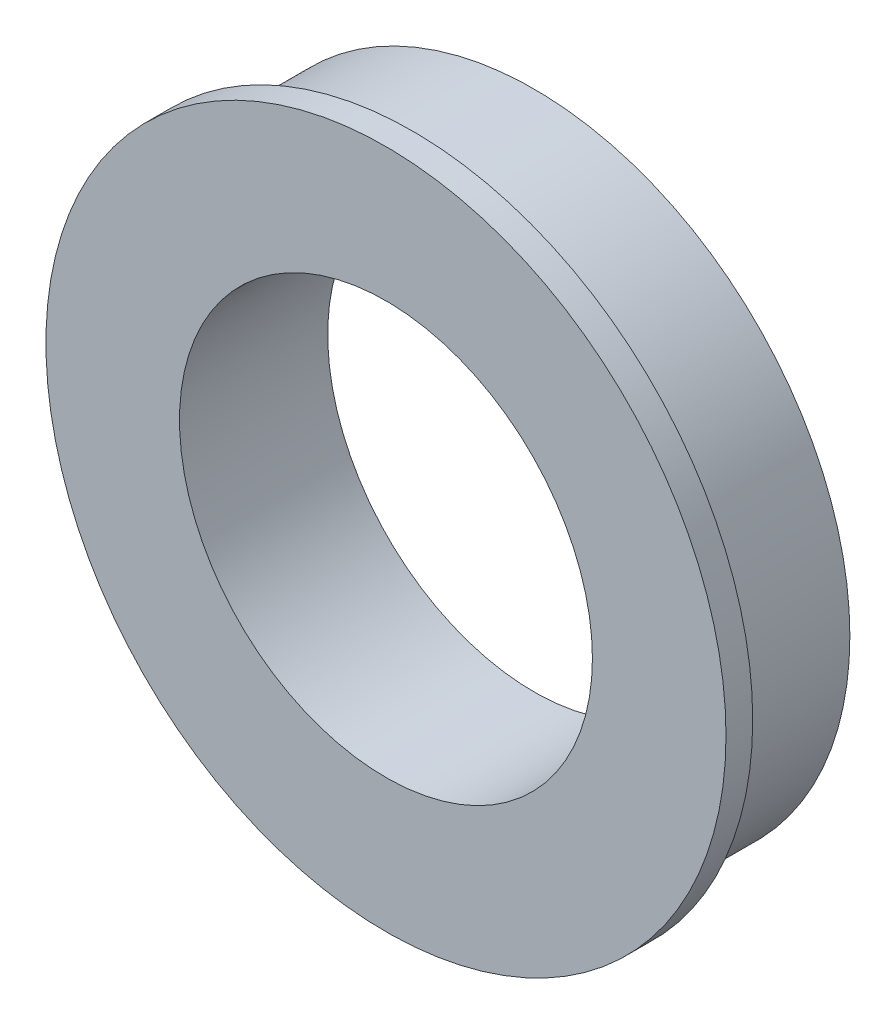
ISO-10303-21;
HEADER;
FILE_DESCRIPTION(('STEP AP214'),'2;1');
FILE_NAME('part.step','',(''),(''),'','','');
FILE_SCHEMA(('AUTOMOTIVE_DESIGN { 1 0 10303 214 1 1 1 1 }'));
ENDSEC;
DATA;
#1=APPLICATION_CONTEXT('core data for automotive mechanical design processes');
#2=APPLICATION_PROTOCOL_DEFINITION('international standard','automotive_design',2000,#1);
#3=PRODUCT_CONTEXT('',#1,'mechanical');
#4=PRODUCT('Part','Part','',(#3));
#5=PRODUCT_RELATED_PRODUCT_CATEGORY('part','',(#4));
#6=PRODUCT_DEFINITION_FORMATION('','',#4);
#7=PRODUCT_DEFINITION_CONTEXT('part definition',#1,'design');
#8=PRODUCT_DEFINITION('design','',#6,#7);
#9=PRODUCT_DEFINITION_SHAPE('','',#8);
#10=(LENGTH_UNIT() NAMED_UNIT(*) SI_UNIT(.MILLI.,.METRE.));
#11=(NAMED_UNIT(*) PLANE_ANGLE_UNIT() SI_UNIT($,.RADIAN.));
#12=(NAMED_UNIT(*) SI_UNIT($,.STERADIAN.) SOLID_ANGLE_UNIT());
#13=UNCERTAINTY_MEASURE_WITH_UNIT(LENGTH_MEASURE(1.E-05),#10,'distance_accuracy_value','');
#14=(GEOMETRIC_REPRESENTATION_CONTEXT(3) GLOBAL_UNCERTAINTY_ASSIGNED_CONTEXT((#13)) GLOBAL_UNIT_ASSIGNED_CONTEXT((#10,
#11,#12)) REPRESENTATION_CONTEXT('',''));
#15=CARTESIAN_POINT('',(0.,0.,0.));
#16=DIRECTION('',(0.,0.,1.));
#17=DIRECTION('',(1.,0.,0.));
#18=AXIS2_PLACEMENT_3D('',#15,#16,#17);
#19=CARTESIAN_POINT('',(0.,0.,0.));
#20=DIRECTION('',(0.,0.,1.));
#21=DIRECTION('',(1.,0.,0.));
#22=AXIS2_PLACEMENT_3D('',#19,#20,#21);
#23=PLANE('',#22);
#24=CARTESIAN_POINT('',(0.,0.,0.));
#25=DIRECTION('',(0.,0.,1.));
#26=DIRECTION('',(1.,0.,0.));
#27=AXIS2_PLACEMENT_3D('',#24,#25,#26);
#28=CIRCLE('',#27,13.);
#29=CARTESIAN_POINT('',(13.,0.,0.));
#30=VERTEX_POINT('',#29);
#31=EDGE_CURVE('E36',#30,#30,#28,.T.);
#32=ORIENTED_EDGE('',*,*,#31,.F.);
#33=EDGE_LOOP('',(#32));
#34=FACE_BOUND('',#33,.T.);
#35=CARTESIAN_POINT('',(0.,0.,0.));
#36=DIRECTION('',(0.,0.,1.));
#37=DIRECTION('',(1.,0.,0.));
#38=AXIS2_PLACEMENT_3D('',#35,#36,#37);
#39=CIRCLE('',#38,8.5);
#40=CARTESIAN_POINT('',(8.5,0.,0.));
#41=VERTEX_POINT('',#40);
#42=EDGE_CURVE('E43',#41,#41,#39,.T.);
#43=ORIENTED_EDGE('',*,*,#42,.T.);
#44=EDGE_LOOP('',(#43));
#45=FACE_BOUND('',#44,.T.);
#46=ADVANCED_FACE('F32',(#34,#45),#23,.F.);
#47=CARTESIAN_POINT('',(0.,0.,5.));
#48=DIRECTION('',(0.,0.,-1.));
#49=DIRECTION('',(-1.,0.,0.));
#50=AXIS2_PLACEMENT_3D('',#47,#48,#49);
#51=CYLINDRICAL_SURFACE('',#50,13.);
#52=CARTESIAN_POINT('',(0.,0.,5.));
#53=DIRECTION('',(0.,0.,1.));
#54=DIRECTION('',(1.,0.,0.));
#55=AXIS2_PLACEMENT_3D('',#52,#53,#54);
#56=CIRCLE('',#55,13.);
#57=CARTESIAN_POINT('',(13.,0.,5.));
#58=VERTEX_POINT('',#57);
#59=EDGE_CURVE('E10',#58,#58,#56,.T.);
#60=ORIENTED_EDGE('',*,*,#59,.F.);
#61=EDGE_LOOP('',(#60));
#62=FACE_BOUND('',#61,.T.);
#63=ORIENTED_EDGE('',*,*,#31,.T.);
#64=EDGE_LOOP('',(#63));
#65=FACE_BOUND('',#64,.T.);
#66=ADVANCED_FACE('F34',(#62,#65),#51,.T.);
#67=CARTESIAN_POINT('',(0.,0.,5.));
#68=DIRECTION('',(0.,0.,-1.));
#69=DIRECTION('',(-1.,0.,0.));
#70=AXIS2_PLACEMENT_3D('',#67,#68,#69);
#71=CYLINDRICAL_SURFACE('',#70,8.5);
#72=ORIENTED_EDGE('',*,*,#42,.F.);
#73=EDGE_LOOP('',(#72));
#74=FACE_BOUND('',#73,.T.);
#75=CARTESIAN_POINT('',(0.,0.,6.1));
#76=DIRECTION('',(0.,0.,1.));
#77=DIRECTION('',(1.,0.,0.));
#78=AXIS2_PLACEMENT_3D('',#75,#76,#77);
#79=CIRCLE('',#78,8.5);
#80=CARTESIAN_POINT('',(8.5,0.,6.1));
#81=VERTEX_POINT('',#80);
#82=EDGE_CURVE('E51',#81,#81,#79,.T.);
#83=ORIENTED_EDGE('',*,*,#82,.T.);
#84=EDGE_LOOP('',(#83));
#85=FACE_BOUND('',#84,.T.);
#86=ADVANCED_FACE('F57',(#74,#85),#71,.F.);
#87=CARTESIAN_POINT('',(0.,0.,6.1));
#88=DIRECTION('',(0.,0.,1.));
#89=DIRECTION('',(1.,0.,0.));
#90=AXIS2_PLACEMENT_3D('',#87,#88,#89);
#91=PLANE('',#90);
#92=CARTESIAN_POINT('',(0.,0.,6.1));
#93=DIRECTION('',(0.,0.,1.));
#94=DIRECTION('',(1.,0.,0.));
#95=AXIS2_PLACEMENT_3D('',#92,#93,#94);
#96=CIRCLE('',#95,14.);
#97=CARTESIAN_POINT('',(14.,0.,6.1));
#98=VERTEX_POINT('',#97);
#99=EDGE_CURVE('E47',#98,#98,#96,.T.);
#100=ORIENTED_EDGE('',*,*,#99,.T.);
#101=EDGE_LOOP('',(#100));
#102=FACE_BOUND('',#101,.T.);
#103=ORIENTED_EDGE('',*,*,#82,.F.);
#104=EDGE_LOOP('',(#103));
#105=FACE_BOUND('',#104,.T.);
#106=ADVANCED_FACE('F59',(#102,#105),#91,.T.);
#107=CARTESIAN_POINT('',(0.,0.,5.));
#108=DIRECTION('',(0.,0.,1.));
#109=DIRECTION('',(1.,0.,0.));
#110=AXIS2_PLACEMENT_3D('',#107,#108,#109);
#111=PLANE('',#110);
#112=ORIENTED_EDGE('',*,*,#59,.T.);
#113=EDGE_LOOP('',(#112));
#114=FACE_BOUND('',#113,.T.);
#115=CARTESIAN_POINT('',(0.,0.,5.));
#116=DIRECTION('',(0.,0.,1.));
#117=DIRECTION('',(1.,0.,0.));
#118=AXIS2_PLACEMENT_3D('',#115,#116,#117);
#119=CIRCLE('',#118,14.);
#120=CARTESIAN_POINT('',(14.,0.,5.));
#121=VERTEX_POINT('',#120);
#122=EDGE_CURVE('E48',#121,#121,#119,.T.);
#123=ORIENTED_EDGE('',*,*,#122,.F.);
#124=EDGE_LOOP('',(#123));
#125=FACE_BOUND('',#124,.T.);
#126=ADVANCED_FACE('F61',(#114,#125),#111,.F.);
#127=CARTESIAN_POINT('',(0.,0.,6.1));
#128=DIRECTION('',(0.,0.,-1.));
#129=DIRECTION('',(-1.,0.,0.));
#130=AXIS2_PLACEMENT_3D('',#127,#128,#129);
#131=CYLINDRICAL_SURFACE('',#130,14.);
#132=ORIENTED_EDGE('',*,*,#99,.F.);
#133=EDGE_LOOP('',(#132));
#134=FACE_BOUND('',#133,.T.);
#135=ORIENTED_EDGE('',*,*,#122,.T.);
#136=EDGE_LOOP('',(#135));
#137=FACE_BOUND('',#136,.T.);
#138=ADVANCED_FACE('F68',(#134,#137),#131,.T.);
#139=CLOSED_SHELL('',(#46,#66,#86,#106,#126,#138));
#140=MANIFOLD_SOLID_BREP('B2',#139);
#141=ADVANCED_BREP_SHAPE_REPRESENTATION('',(#18,#140),#14);
#142=SHAPE_DEFINITION_REPRESENTATION(#9,#141);
ENDSEC;
END-ISO-10303-21;
